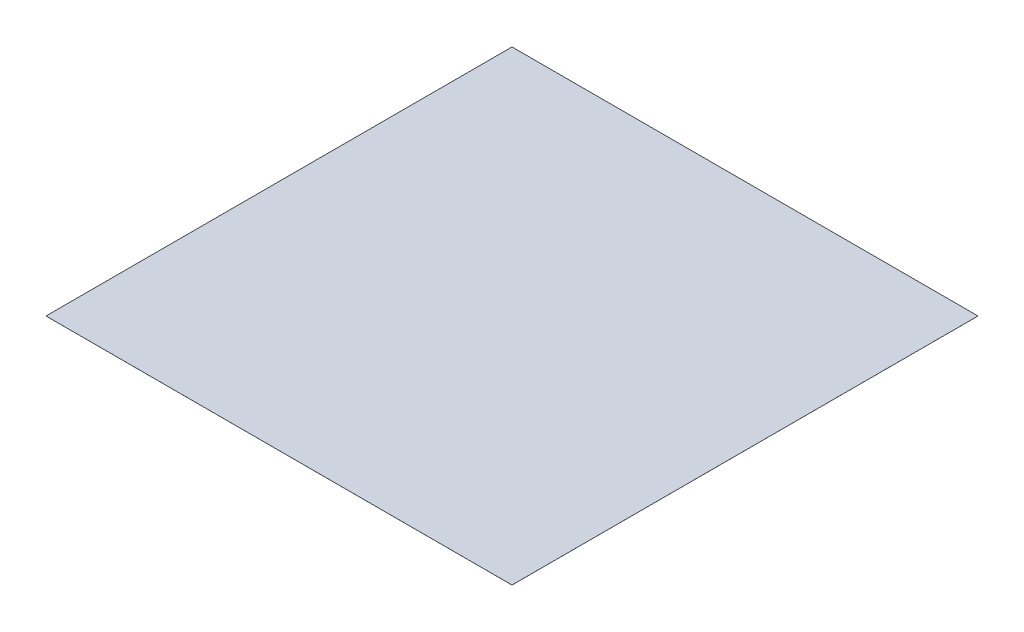
ISO-10303-21;
HEADER;
FILE_DESCRIPTION(('STEP AP214'),'2;1');
FILE_NAME('part.step','',(''),(''),'','','');
FILE_SCHEMA(('AUTOMOTIVE_DESIGN { 1 0 10303 214 1 1 1 1 }'));
ENDSEC;
DATA;
#1=APPLICATION_CONTEXT('core data for automotive mechanical design processes');
#2=APPLICATION_PROTOCOL_DEFINITION('international standard','automotive_design',2000,#1);
#3=PRODUCT_CONTEXT('',#1,'mechanical');
#4=PRODUCT('Part','Part','',(#3));
#5=PRODUCT_RELATED_PRODUCT_CATEGORY('part','',(#4));
#6=PRODUCT_DEFINITION_FORMATION('','',#4);
#7=PRODUCT_DEFINITION_CONTEXT('part definition',#1,'design');
#8=PRODUCT_DEFINITION('design','',#6,#7);
#9=PRODUCT_DEFINITION_SHAPE('','',#8);
#10=(LENGTH_UNIT() NAMED_UNIT(*) SI_UNIT(.MILLI.,.METRE.));
#11=(NAMED_UNIT(*) PLANE_ANGLE_UNIT() SI_UNIT($,.RADIAN.));
#12=(NAMED_UNIT(*) SI_UNIT($,.STERADIAN.) SOLID_ANGLE_UNIT());
#13=UNCERTAINTY_MEASURE_WITH_UNIT(LENGTH_MEASURE(1.E-05),#10,'distance_accuracy_value','');
#14=(GEOMETRIC_REPRESENTATION_CONTEXT(3) GLOBAL_UNCERTAINTY_ASSIGNED_CONTEXT((#13)) GLOBAL_UNIT_ASSIGNED_CONTEXT((#10,
#11,#12)) REPRESENTATION_CONTEXT('',''));
#15=CARTESIAN_POINT('',(0.,0.,0.));
#16=DIRECTION('',(0.,0.,1.));
#17=DIRECTION('',(1.,0.,0.));
#18=AXIS2_PLACEMENT_3D('',#15,#16,#17);
#19=CARTESIAN_POINT('',(-100.,0.01,100.));
#20=DIRECTION('',(1.,0.,0.));
#21=DIRECTION('',(0.,0.,-1.));
#22=AXIS2_PLACEMENT_3D('',#19,#20,#21);
#23=PLANE('',#22);
#24=DIRECTION('',(0.,0.,1.));
#25=VECTOR('',#24,1.);
#26=CARTESIAN_POINT('',(-100.,0.,100.));
#27=LINE('',#26,#25);
#28=CARTESIAN_POINT('',(-100.,0.,-100.));
#29=VERTEX_POINT('',#28);
#30=CARTESIAN_POINT('',(-100.,0.,100.));
#31=VERTEX_POINT('',#30);
#32=EDGE_CURVE('E97',#29,#31,#27,.T.);
#33=ORIENTED_EDGE('',*,*,#32,.T.);
#34=DIRECTION('',(0.,-1.,0.));
#35=VECTOR('',#34,1.);
#36=CARTESIAN_POINT('',(-100.,0.01,100.));
#37=LINE('',#36,#35);
#38=CARTESIAN_POINT('',(-100.,0.01,100.));
#39=VERTEX_POINT('',#38);
#40=EDGE_CURVE('E11',#39,#31,#37,.T.);
#41=ORIENTED_EDGE('',*,*,#40,.F.);
#42=DIRECTION('',(0.,0.,1.));
#43=VECTOR('',#42,1.);
#44=CARTESIAN_POINT('',(-100.,0.01,100.));
#45=LINE('',#44,#43);
#46=CARTESIAN_POINT('',(-100.,0.01,-100.));
#47=VERTEX_POINT('',#46);
#48=EDGE_CURVE('E85',#47,#39,#45,.T.);
#49=ORIENTED_EDGE('',*,*,#48,.F.);
#50=DIRECTION('',(0.,-1.,0.));
#51=VECTOR('',#50,1.);
#52=CARTESIAN_POINT('',(-100.,0.01,-100.));
#53=LINE('',#52,#51);
#54=EDGE_CURVE('E93',#47,#29,#53,.T.);
#55=ORIENTED_EDGE('',*,*,#54,.T.);
#56=EDGE_LOOP('',(#33,#41,#49,#55));
#57=FACE_BOUND('',#56,.T.);
#58=ADVANCED_FACE('F34',(#57),#23,.F.);
#59=CARTESIAN_POINT('',(99.9999999999999,0.01,100.));
#60=DIRECTION('',(0.,0.,-1.));
#61=DIRECTION('',(-1.,0.,0.));
#62=AXIS2_PLACEMENT_3D('',#59,#60,#61);
#63=PLANE('',#62);
#64=DIRECTION('',(1.,0.,0.));
#65=VECTOR('',#64,1.);
#66=CARTESIAN_POINT('',(99.9999999999999,0.,100.));
#67=LINE('',#66,#65);
#68=CARTESIAN_POINT('',(99.9999999999999,0.,100.));
#69=VERTEX_POINT('',#68);
#70=EDGE_CURVE('E89',#31,#69,#67,.T.);
#71=ORIENTED_EDGE('',*,*,#70,.T.);
#72=DIRECTION('',(0.,-1.,0.));
#73=VECTOR('',#72,1.);
#74=CARTESIAN_POINT('',(99.9999999999999,0.01,100.));
#75=LINE('',#74,#73);
#76=CARTESIAN_POINT('',(99.9999999999999,0.01,100.));
#77=VERTEX_POINT('',#76);
#78=EDGE_CURVE('E42',#77,#69,#75,.T.);
#79=ORIENTED_EDGE('',*,*,#78,.F.);
#80=DIRECTION('',(1.,0.,0.));
#81=VECTOR('',#80,1.);
#82=CARTESIAN_POINT('',(99.9999999999999,0.01,100.));
#83=LINE('',#82,#81);
#84=EDGE_CURVE('E80',#39,#77,#83,.T.);
#85=ORIENTED_EDGE('',*,*,#84,.F.);
#86=ORIENTED_EDGE('',*,*,#40,.T.);
#87=EDGE_LOOP('',(#71,#79,#85,#86));
#88=FACE_BOUND('',#87,.T.);
#89=ADVANCED_FACE('F88',(#88),#63,.F.);
#90=CARTESIAN_POINT('',(99.9999999999999,0.01,100.));
#91=DIRECTION('',(-1.,0.,0.));
#92=DIRECTION('',(0.,0.,1.));
#93=AXIS2_PLACEMENT_3D('',#90,#91,#92);
#94=PLANE('',#93);
#95=DIRECTION('',(0.,0.,-1.));
#96=VECTOR('',#95,1.);
#97=CARTESIAN_POINT('',(99.9999999999999,0.,100.));
#98=LINE('',#97,#96);
#99=CARTESIAN_POINT('',(99.9999999999999,0.,-100.));
#100=VERTEX_POINT('',#99);
#101=EDGE_CURVE('E67',#69,#100,#98,.T.);
#102=ORIENTED_EDGE('',*,*,#101,.T.);
#103=DIRECTION('',(0.,-1.,0.));
#104=VECTOR('',#103,1.);
#105=CARTESIAN_POINT('',(99.9999999999999,0.01,-100.));
#106=LINE('',#105,#104);
#107=CARTESIAN_POINT('',(99.9999999999999,0.01,-100.));
#108=VERTEX_POINT('',#107);
#109=EDGE_CURVE('E90',#108,#100,#106,.T.);
#110=ORIENTED_EDGE('',*,*,#109,.F.);
#111=DIRECTION('',(0.,0.,-1.));
#112=VECTOR('',#111,1.);
#113=CARTESIAN_POINT('',(99.9999999999999,0.01,100.));
#114=LINE('',#113,#112);
#115=EDGE_CURVE('E83',#77,#108,#114,.T.);
#116=ORIENTED_EDGE('',*,*,#115,.F.);
#117=ORIENTED_EDGE('',*,*,#78,.T.);
#118=EDGE_LOOP('',(#102,#110,#116,#117));
#119=FACE_BOUND('',#118,.T.);
#120=ADVANCED_FACE('F91',(#119),#94,.F.);
#121=CARTESIAN_POINT('',(99.9999999999999,0.01,-100.));
#122=DIRECTION('',(0.,0.,1.));
#123=DIRECTION('',(1.,0.,0.));
#124=AXIS2_PLACEMENT_3D('',#121,#122,#123);
#125=PLANE('',#124);
#126=DIRECTION('',(-1.,0.,0.));
#127=VECTOR('',#126,1.);
#128=CARTESIAN_POINT('',(99.9999999999999,0.,-100.));
#129=LINE('',#128,#127);
#130=EDGE_CURVE('E73',#100,#29,#129,.T.);
#131=ORIENTED_EDGE('',*,*,#130,.T.);
#132=ORIENTED_EDGE('',*,*,#54,.F.);
#133=DIRECTION('',(-1.,0.,0.));
#134=VECTOR('',#133,1.);
#135=CARTESIAN_POINT('',(99.9999999999999,0.01,-100.));
#136=LINE('',#135,#134);
#137=EDGE_CURVE('E50',#108,#47,#136,.T.);
#138=ORIENTED_EDGE('',*,*,#137,.F.);
#139=ORIENTED_EDGE('',*,*,#109,.T.);
#140=EDGE_LOOP('',(#131,#132,#138,#139));
#141=FACE_BOUND('',#140,.T.);
#142=ADVANCED_FACE('F104',(#141),#125,.F.);
#143=CARTESIAN_POINT('',(0.,0.01,0.));
#144=DIRECTION('',(0.,1.,0.));
#145=DIRECTION('',(0.,0.,1.));
#146=AXIS2_PLACEMENT_3D('',#143,#144,#145);
#147=PLANE('',#146);
#148=ORIENTED_EDGE('',*,*,#48,.T.);
#149=ORIENTED_EDGE('',*,*,#84,.T.);
#150=ORIENTED_EDGE('',*,*,#115,.T.);
#151=ORIENTED_EDGE('',*,*,#137,.T.);
#152=EDGE_LOOP('',(#148,#149,#150,#151));
#153=FACE_BOUND('',#152,.T.);
#154=ADVANCED_FACE('F81',(#153),#147,.T.);
#155=CARTESIAN_POINT('',(0.,0.,0.));
#156=DIRECTION('',(0.,1.,0.));
#157=DIRECTION('',(0.,0.,1.));
#158=AXIS2_PLACEMENT_3D('',#155,#156,#157);
#159=PLANE('',#158);
#160=ORIENTED_EDGE('',*,*,#32,.F.);
#161=ORIENTED_EDGE('',*,*,#130,.F.);
#162=ORIENTED_EDGE('',*,*,#101,.F.);
#163=ORIENTED_EDGE('',*,*,#70,.F.);
#164=EDGE_LOOP('',(#160,#161,#162,#163));
#165=FACE_BOUND('',#164,.T.);
#166=ADVANCED_FACE('F107',(#165),#159,.F.);
#167=CLOSED_SHELL('',(#58,#89,#120,#142,#154,#166));
#168=MANIFOLD_SOLID_BREP('B2',#167);
#169=ADVANCED_BREP_SHAPE_REPRESENTATION('',(#18,#168),#14);
#170=SHAPE_DEFINITION_REPRESENTATION(#9,#169);
ENDSEC;
END-ISO-10303-21;
